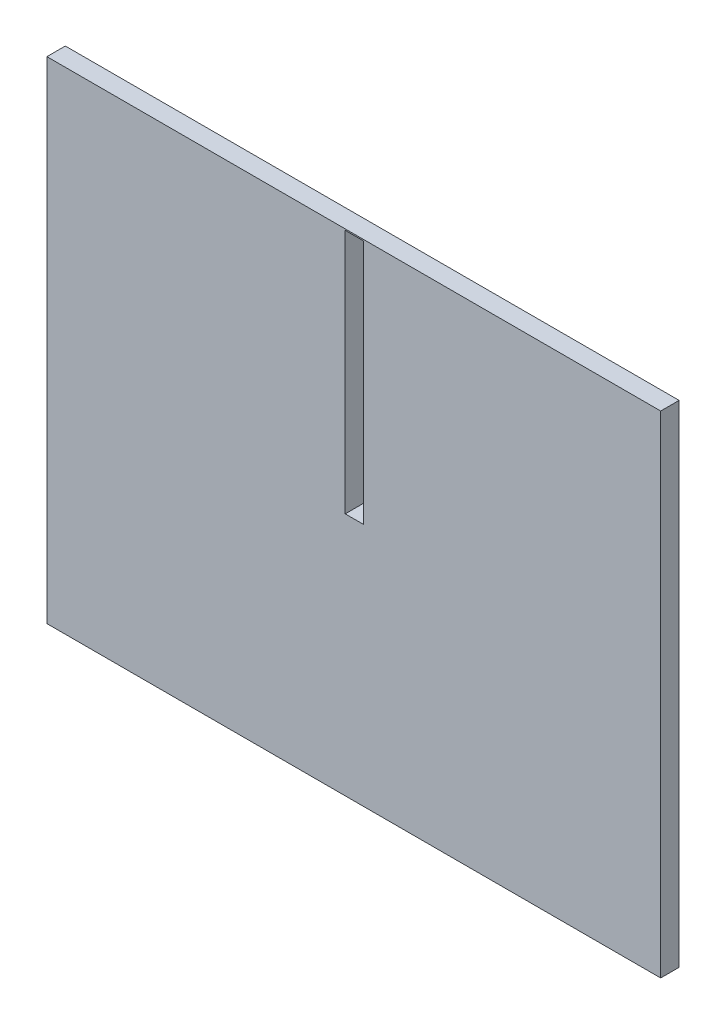
ISO-10303-21;
HEADER;
FILE_DESCRIPTION(('STEP AP214'),'2;1');
FILE_NAME('part.step','',(''),(''),'','','');
FILE_SCHEMA(('AUTOMOTIVE_DESIGN { 1 0 10303 214 1 1 1 1 }'));
ENDSEC;
DATA;
#1=APPLICATION_CONTEXT('core data for automotive mechanical design processes');
#2=APPLICATION_PROTOCOL_DEFINITION('international standard','automotive_design',2000,#1);
#3=PRODUCT_CONTEXT('',#1,'mechanical');
#4=PRODUCT('Part','Part','',(#3));
#5=PRODUCT_RELATED_PRODUCT_CATEGORY('part','',(#4));
#6=PRODUCT_DEFINITION_FORMATION('','',#4);
#7=PRODUCT_DEFINITION_CONTEXT('part definition',#1,'design');
#8=PRODUCT_DEFINITION('design','',#6,#7);
#9=PRODUCT_DEFINITION_SHAPE('','',#8);
#10=(LENGTH_UNIT() NAMED_UNIT(*) SI_UNIT(.MILLI.,.METRE.));
#11=(NAMED_UNIT(*) PLANE_ANGLE_UNIT() SI_UNIT($,.RADIAN.));
#12=(NAMED_UNIT(*) SI_UNIT($,.STERADIAN.) SOLID_ANGLE_UNIT());
#13=UNCERTAINTY_MEASURE_WITH_UNIT(LENGTH_MEASURE(1.E-05),#10,'distance_accuracy_value','');
#14=(GEOMETRIC_REPRESENTATION_CONTEXT(3) GLOBAL_UNCERTAINTY_ASSIGNED_CONTEXT((#13)) GLOBAL_UNIT_ASSIGNED_CONTEXT((#10,
#11,#12)) REPRESENTATION_CONTEXT('',''));
#15=CARTESIAN_POINT('',(0.,0.,0.));
#16=DIRECTION('',(0.,0.,1.));
#17=DIRECTION('',(1.,0.,0.));
#18=AXIS2_PLACEMENT_3D('',#15,#16,#17);
#19=CARTESIAN_POINT('',(-50.,-40.,3.));
#20=DIRECTION('',(-1.,0.,0.));
#21=DIRECTION('',(0.,0.,1.));
#22=AXIS2_PLACEMENT_3D('',#19,#20,#21);
#23=PLANE('',#22);
#24=DIRECTION('',(0.,1.,0.));
#25=VECTOR('',#24,1.);
#26=CARTESIAN_POINT('',(-50.,-40.,0.));
#27=LINE('',#26,#25);
#28=CARTESIAN_POINT('',(-50.,-40.,0.));
#29=VERTEX_POINT('',#28);
#30=CARTESIAN_POINT('',(-50.,40.,0.));
#31=VERTEX_POINT('',#30);
#32=EDGE_CURVE('E151',#29,#31,#27,.T.);
#33=ORIENTED_EDGE('',*,*,#32,.F.);
#34=DIRECTION('',(0.,0.,-1.));
#35=VECTOR('',#34,1.);
#36=CARTESIAN_POINT('',(-50.,-40.,3.));
#37=LINE('',#36,#35);
#38=CARTESIAN_POINT('',(-50.,-40.,3.));
#39=VERTEX_POINT('',#38);
#40=EDGE_CURVE('E107',#39,#29,#37,.T.);
#41=ORIENTED_EDGE('',*,*,#40,.F.);
#42=DIRECTION('',(0.,1.,0.));
#43=VECTOR('',#42,1.);
#44=CARTESIAN_POINT('',(-50.,-40.,3.));
#45=LINE('',#44,#43);
#46=CARTESIAN_POINT('',(-50.,40.,3.));
#47=VERTEX_POINT('',#46);
#48=EDGE_CURVE('E142',#39,#47,#45,.T.);
#49=ORIENTED_EDGE('',*,*,#48,.T.);
#50=DIRECTION('',(0.,0.,-1.));
#51=VECTOR('',#50,1.);
#52=CARTESIAN_POINT('',(-50.,40.,3.));
#53=LINE('',#52,#51);
#54=EDGE_CURVE('E126',#47,#31,#53,.T.);
#55=ORIENTED_EDGE('',*,*,#54,.T.);
#56=EDGE_LOOP('',(#33,#41,#49,#55));
#57=FACE_BOUND('',#56,.T.);
#58=ADVANCED_FACE('F39',(#57),#23,.T.);
#59=CARTESIAN_POINT('',(-50.,-40.,3.));
#60=DIRECTION('',(0.,1.,0.));
#61=DIRECTION('',(0.,0.,1.));
#62=AXIS2_PLACEMENT_3D('',#59,#60,#61);
#63=PLANE('',#62);
#64=DIRECTION('',(1.,0.,0.));
#65=VECTOR('',#64,1.);
#66=CARTESIAN_POINT('',(-50.,-40.,0.));
#67=LINE('',#66,#65);
#68=CARTESIAN_POINT('',(50.,-40.,0.));
#69=VERTEX_POINT('',#68);
#70=EDGE_CURVE('E139',#29,#69,#67,.T.);
#71=ORIENTED_EDGE('',*,*,#70,.T.);
#72=DIRECTION('',(0.,0.,-1.));
#73=VECTOR('',#72,1.);
#74=CARTESIAN_POINT('',(50.,-40.,3.));
#75=LINE('',#74,#73);
#76=CARTESIAN_POINT('',(50.,-40.,3.));
#77=VERTEX_POINT('',#76);
#78=EDGE_CURVE('E133',#77,#69,#75,.T.);
#79=ORIENTED_EDGE('',*,*,#78,.F.);
#80=DIRECTION('',(1.,0.,0.));
#81=VECTOR('',#80,1.);
#82=CARTESIAN_POINT('',(-50.,-40.,3.));
#83=LINE('',#82,#81);
#84=EDGE_CURVE('E130',#39,#77,#83,.T.);
#85=ORIENTED_EDGE('',*,*,#84,.F.);
#86=ORIENTED_EDGE('',*,*,#40,.T.);
#87=EDGE_LOOP('',(#71,#79,#85,#86));
#88=FACE_BOUND('',#87,.T.);
#89=ADVANCED_FACE('F207',(#88),#63,.F.);
#90=CARTESIAN_POINT('',(50.,-40.,3.));
#91=DIRECTION('',(-1.,0.,0.));
#92=DIRECTION('',(0.,0.,1.));
#93=AXIS2_PLACEMENT_3D('',#90,#91,#92);
#94=PLANE('',#93);
#95=DIRECTION('',(0.,1.,0.));
#96=VECTOR('',#95,1.);
#97=CARTESIAN_POINT('',(50.,-40.,0.));
#98=LINE('',#97,#96);
#99=CARTESIAN_POINT('',(50.,40.,0.));
#100=VERTEX_POINT('',#99);
#101=EDGE_CURVE('E143',#69,#100,#98,.T.);
#102=ORIENTED_EDGE('',*,*,#101,.T.);
#103=DIRECTION('',(0.,0.,-1.));
#104=VECTOR('',#103,1.);
#105=CARTESIAN_POINT('',(50.,40.,3.));
#106=LINE('',#105,#104);
#107=CARTESIAN_POINT('',(50.,40.,3.));
#108=VERTEX_POINT('',#107);
#109=EDGE_CURVE('E129',#108,#100,#106,.T.);
#110=ORIENTED_EDGE('',*,*,#109,.F.);
#111=DIRECTION('',(0.,1.,0.));
#112=VECTOR('',#111,1.);
#113=CARTESIAN_POINT('',(50.,-40.,3.));
#114=LINE('',#113,#112);
#115=EDGE_CURVE('E158',#77,#108,#114,.T.);
#116=ORIENTED_EDGE('',*,*,#115,.F.);
#117=ORIENTED_EDGE('',*,*,#78,.T.);
#118=EDGE_LOOP('',(#102,#110,#116,#117));
#119=FACE_BOUND('',#118,.T.);
#120=ADVANCED_FACE('F212',(#119),#94,.F.);
#121=CARTESIAN_POINT('',(-50.,40.,3.));
#122=DIRECTION('',(0.,1.,0.));
#123=DIRECTION('',(0.,0.,1.));
#124=AXIS2_PLACEMENT_3D('',#121,#122,#123);
#125=PLANE('',#124);
#126=DIRECTION('',(1.,0.,0.));
#127=VECTOR('',#126,1.);
#128=CARTESIAN_POINT('',(-50.,40.,0.));
#129=LINE('',#128,#127);
#130=EDGE_CURVE('E147',#31,#100,#129,.T.);
#131=ORIENTED_EDGE('',*,*,#130,.F.);
#132=ORIENTED_EDGE('',*,*,#54,.F.);
#133=DIRECTION('',(1.,0.,0.));
#134=VECTOR('',#133,1.);
#135=CARTESIAN_POINT('',(-50.,40.,3.));
#136=LINE('',#135,#134);
#137=EDGE_CURVE('E161',#47,#108,#136,.T.);
#138=ORIENTED_EDGE('',*,*,#137,.T.);
#139=ORIENTED_EDGE('',*,*,#109,.T.);
#140=EDGE_LOOP('',(#131,#132,#138,#139));
#141=FACE_BOUND('',#140,.T.);
#142=ADVANCED_FACE('F196',(#141),#125,.T.);
#143=CARTESIAN_POINT('',(0.,0.,3.));
#144=DIRECTION('',(0.,0.,-1.));
#145=DIRECTION('',(-1.,0.,0.));
#146=AXIS2_PLACEMENT_3D('',#143,#144,#145);
#147=PLANE('',#146);
#148=DIRECTION('',(1.,0.,0.));
#149=VECTOR('',#148,1.);
#150=CARTESIAN_POINT('',(0.,-0.210105625964907,3.));
#151=LINE('',#150,#149);
#152=CARTESIAN_POINT('',(-1.39494718701755,-0.210105625964907,3.));
#153=VERTEX_POINT('',#152);
#154=CARTESIAN_POINT('',(1.60505281298245,-0.210105625964907,3.));
#155=VERTEX_POINT('',#154);
#156=EDGE_CURVE('E171',#153,#155,#151,.T.);
#157=ORIENTED_EDGE('',*,*,#156,.F.);
#158=DIRECTION('',(0.,1.,0.));
#159=VECTOR('',#158,1.);
#160=CARTESIAN_POINT('',(-1.39494718701755,0.,3.));
#161=LINE('',#160,#159);
#162=CARTESIAN_POINT('',(-1.39494718701755,39.7898943740351,3.));
#163=VERTEX_POINT('',#162);
#164=EDGE_CURVE('E155',#153,#163,#161,.T.);
#165=ORIENTED_EDGE('',*,*,#164,.T.);
#166=DIRECTION('',(1.,0.,0.));
#167=VECTOR('',#166,1.);
#168=CARTESIAN_POINT('',(0.,39.7898943740351,3.));
#169=LINE('',#168,#167);
#170=CARTESIAN_POINT('',(1.60505281298245,39.7898943740351,3.));
#171=VERTEX_POINT('',#170);
#172=EDGE_CURVE('E176',#163,#171,#169,.T.);
#173=ORIENTED_EDGE('',*,*,#172,.T.);
#174=DIRECTION('',(0.,1.,0.));
#175=VECTOR('',#174,1.);
#176=CARTESIAN_POINT('',(1.60505281298245,0.,3.));
#177=LINE('',#176,#175);
#178=EDGE_CURVE('E114',#155,#171,#177,.T.);
#179=ORIENTED_EDGE('',*,*,#178,.F.);
#180=EDGE_LOOP('',(#157,#165,#173,#179));
#181=FACE_BOUND('',#180,.T.);
#182=ORIENTED_EDGE('',*,*,#48,.F.);
#183=ORIENTED_EDGE('',*,*,#84,.T.);
#184=ORIENTED_EDGE('',*,*,#115,.T.);
#185=ORIENTED_EDGE('',*,*,#137,.F.);
#186=EDGE_LOOP('',(#182,#183,#184,#185));
#187=FACE_BOUND('',#186,.T.);
#188=ADVANCED_FACE('F193',(#181,#187),#147,.F.);
#189=CARTESIAN_POINT('',(0.,0.,0.));
#190=DIRECTION('',(0.,0.,-1.));
#191=DIRECTION('',(-1.,0.,0.));
#192=AXIS2_PLACEMENT_3D('',#189,#190,#191);
#193=PLANE('',#192);
#194=DIRECTION('',(0.,1.,0.));
#195=VECTOR('',#194,1.);
#196=CARTESIAN_POINT('',(-1.39494718701755,0.,0.));
#197=LINE('',#196,#195);
#198=CARTESIAN_POINT('',(-1.39494718701755,-0.210105625964907,0.));
#199=VERTEX_POINT('',#198);
#200=CARTESIAN_POINT('',(-1.39494718701755,39.7898943740351,0.));
#201=VERTEX_POINT('',#200);
#202=EDGE_CURVE('E11',#199,#201,#197,.T.);
#203=ORIENTED_EDGE('',*,*,#202,.F.);
#204=DIRECTION('',(1.,0.,0.));
#205=VECTOR('',#204,1.);
#206=CARTESIAN_POINT('',(0.,-0.210105625964907,0.));
#207=LINE('',#206,#205);
#208=CARTESIAN_POINT('',(1.60505281298245,-0.210105625964907,0.));
#209=VERTEX_POINT('',#208);
#210=EDGE_CURVE('E47',#199,#209,#207,.T.);
#211=ORIENTED_EDGE('',*,*,#210,.T.);
#212=DIRECTION('',(0.,1.,0.));
#213=VECTOR('',#212,1.);
#214=CARTESIAN_POINT('',(1.60505281298245,0.,0.));
#215=LINE('',#214,#213);
#216=CARTESIAN_POINT('',(1.60505281298245,39.7898943740351,0.));
#217=VERTEX_POINT('',#216);
#218=EDGE_CURVE('E106',#209,#217,#215,.T.);
#219=ORIENTED_EDGE('',*,*,#218,.T.);
#220=DIRECTION('',(1.,0.,0.));
#221=VECTOR('',#220,1.);
#222=CARTESIAN_POINT('',(0.,39.7898943740351,0.));
#223=LINE('',#222,#221);
#224=EDGE_CURVE('E100',#201,#217,#223,.T.);
#225=ORIENTED_EDGE('',*,*,#224,.F.);
#226=EDGE_LOOP('',(#203,#211,#219,#225));
#227=FACE_BOUND('',#226,.T.);
#228=ORIENTED_EDGE('',*,*,#32,.T.);
#229=ORIENTED_EDGE('',*,*,#130,.T.);
#230=ORIENTED_EDGE('',*,*,#101,.F.);
#231=ORIENTED_EDGE('',*,*,#70,.F.);
#232=EDGE_LOOP('',(#228,#229,#230,#231));
#233=FACE_BOUND('',#232,.T.);
#234=ADVANCED_FACE('F120',(#227,#233),#193,.T.);
#235=CARTESIAN_POINT('',(-1.39494718701755,-0.210105625964907,25.));
#236=DIRECTION('',(-1.,0.,0.));
#237=DIRECTION('',(0.,0.,1.));
#238=AXIS2_PLACEMENT_3D('',#235,#236,#237);
#239=PLANE('',#238);
#240=DIRECTION('',(0.,0.,-1.));
#241=VECTOR('',#240,1.);
#242=CARTESIAN_POINT('',(-1.39494718701755,-0.210105625964907,25.));
#243=LINE('',#242,#241);
#244=EDGE_CURVE('E179',#153,#199,#243,.T.);
#245=ORIENTED_EDGE('',*,*,#244,.T.);
#246=ORIENTED_EDGE('',*,*,#202,.T.);
#247=DIRECTION('',(0.,0.,-1.));
#248=VECTOR('',#247,1.);
#249=CARTESIAN_POINT('',(-1.39494718701755,39.7898943740351,25.));
#250=LINE('',#249,#248);
#251=EDGE_CURVE('E59',#163,#201,#250,.T.);
#252=ORIENTED_EDGE('',*,*,#251,.F.);
#253=ORIENTED_EDGE('',*,*,#164,.F.);
#254=EDGE_LOOP('',(#245,#246,#252,#253));
#255=FACE_BOUND('',#254,.T.);
#256=ADVANCED_FACE('F188',(#255),#239,.F.);
#257=CARTESIAN_POINT('',(-1.39494718701755,-0.210105625964907,25.));
#258=DIRECTION('',(0.,1.,0.));
#259=DIRECTION('',(0.,0.,1.));
#260=AXIS2_PLACEMENT_3D('',#257,#258,#259);
#261=PLANE('',#260);
#262=ORIENTED_EDGE('',*,*,#156,.T.);
#263=DIRECTION('',(0.,0.,-1.));
#264=VECTOR('',#263,1.);
#265=CARTESIAN_POINT('',(1.60505281298245,-0.210105625964907,25.));
#266=LINE('',#265,#264);
#267=EDGE_CURVE('E117',#155,#209,#266,.T.);
#268=ORIENTED_EDGE('',*,*,#267,.T.);
#269=ORIENTED_EDGE('',*,*,#210,.F.);
#270=ORIENTED_EDGE('',*,*,#244,.F.);
#271=EDGE_LOOP('',(#262,#268,#269,#270));
#272=FACE_BOUND('',#271,.T.);
#273=ADVANCED_FACE('F191',(#272),#261,.T.);
#274=CARTESIAN_POINT('',(1.60505281298245,-0.210105625964907,25.));
#275=DIRECTION('',(-1.,0.,0.));
#276=DIRECTION('',(0.,0.,1.));
#277=AXIS2_PLACEMENT_3D('',#274,#275,#276);
#278=PLANE('',#277);
#279=ORIENTED_EDGE('',*,*,#178,.T.);
#280=DIRECTION('',(0.,0.,-1.));
#281=VECTOR('',#280,1.);
#282=CARTESIAN_POINT('',(1.60505281298245,39.7898943740351,25.));
#283=LINE('',#282,#281);
#284=EDGE_CURVE('E54',#171,#217,#283,.T.);
#285=ORIENTED_EDGE('',*,*,#284,.T.);
#286=ORIENTED_EDGE('',*,*,#218,.F.);
#287=ORIENTED_EDGE('',*,*,#267,.F.);
#288=EDGE_LOOP('',(#279,#285,#286,#287));
#289=FACE_BOUND('',#288,.T.);
#290=ADVANCED_FACE('F110',(#289),#278,.T.);
#291=CARTESIAN_POINT('',(-1.39494718701755,39.7898943740351,25.));
#292=DIRECTION('',(0.,1.,0.));
#293=DIRECTION('',(0.,0.,1.));
#294=AXIS2_PLACEMENT_3D('',#291,#292,#293);
#295=PLANE('',#294);
#296=ORIENTED_EDGE('',*,*,#251,.T.);
#297=ORIENTED_EDGE('',*,*,#224,.T.);
#298=ORIENTED_EDGE('',*,*,#284,.F.);
#299=ORIENTED_EDGE('',*,*,#172,.F.);
#300=EDGE_LOOP('',(#296,#297,#298,#299));
#301=FACE_BOUND('',#300,.T.);
#302=ADVANCED_FACE('F101',(#301),#295,.F.);
#303=CLOSED_SHELL('',(#58,#89,#120,#142,#188,#234,#256,#273,#290,#302));
#304=MANIFOLD_SOLID_BREP('B2',#303);
#305=ADVANCED_BREP_SHAPE_REPRESENTATION('',(#18,#304),#14);
#306=SHAPE_DEFINITION_REPRESENTATION(#9,#305);
ENDSEC;
END-ISO-10303-21;
